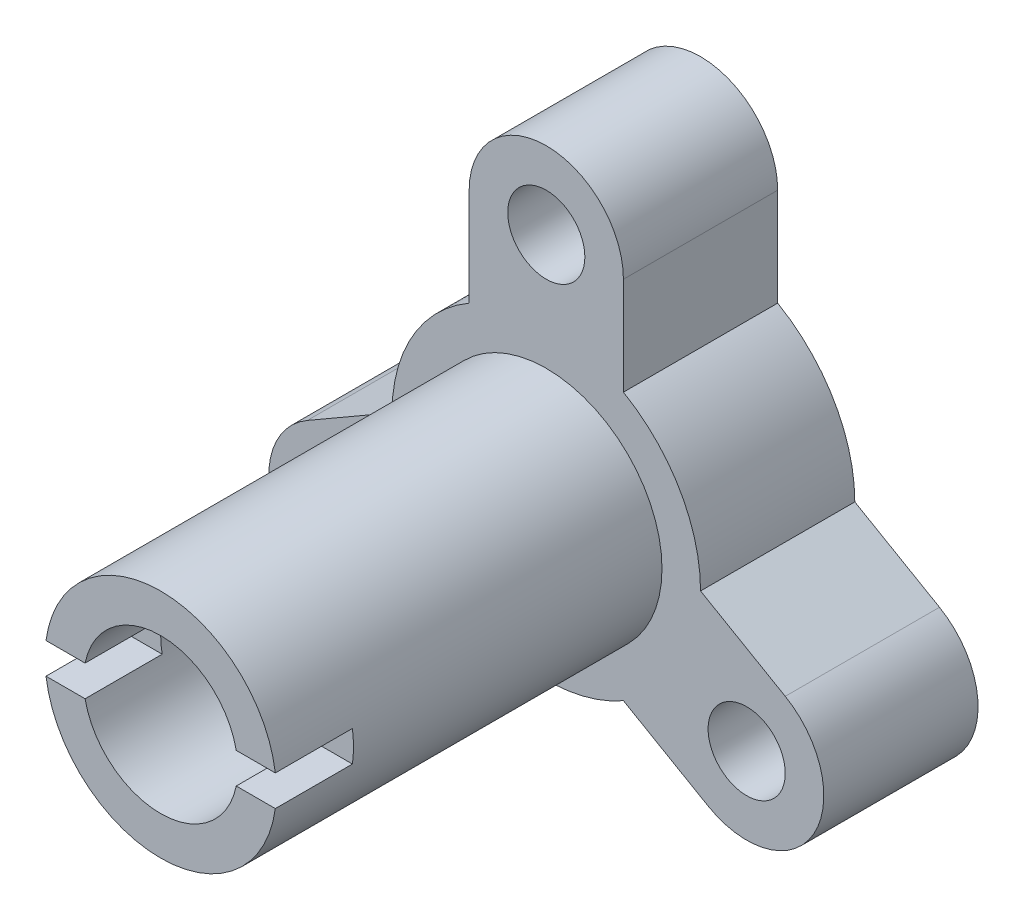
ISO-10303-21;
HEADER;
FILE_DESCRIPTION(('STEP AP214'),'2;1');
FILE_NAME('part.step','',(''),(''),'','','');
FILE_SCHEMA(('AUTOMOTIVE_DESIGN { 1 0 10303 214 1 1 1 1 }'));
ENDSEC;
DATA;
#1=APPLICATION_CONTEXT('core data for automotive mechanical design processes');
#2=APPLICATION_PROTOCOL_DEFINITION('international standard','automotive_design',2000,#1);
#3=PRODUCT_CONTEXT('',#1,'mechanical');
#4=PRODUCT('Part','Part','',(#3));
#5=PRODUCT_RELATED_PRODUCT_CATEGORY('part','',(#4));
#6=PRODUCT_DEFINITION_FORMATION('','',#4);
#7=PRODUCT_DEFINITION_CONTEXT('part definition',#1,'design');
#8=PRODUCT_DEFINITION('design','',#6,#7);
#9=PRODUCT_DEFINITION_SHAPE('','',#8);
#10=(LENGTH_UNIT() NAMED_UNIT(*) SI_UNIT(.MILLI.,.METRE.));
#11=(NAMED_UNIT(*) PLANE_ANGLE_UNIT() SI_UNIT($,.RADIAN.));
#12=(NAMED_UNIT(*) SI_UNIT($,.STERADIAN.) SOLID_ANGLE_UNIT());
#13=UNCERTAINTY_MEASURE_WITH_UNIT(LENGTH_MEASURE(1.E-05),#10,'distance_accuracy_value','');
#14=(GEOMETRIC_REPRESENTATION_CONTEXT(3) GLOBAL_UNCERTAINTY_ASSIGNED_CONTEXT((#13)) GLOBAL_UNIT_ASSIGNED_CONTEXT((#10,
#11,#12)) REPRESENTATION_CONTEXT('',''));
#15=CARTESIAN_POINT('',(0.,0.,0.));
#16=DIRECTION('',(0.,0.,1.));
#17=DIRECTION('',(1.,0.,0.));
#18=AXIS2_PLACEMENT_3D('',#15,#16,#17);
#19=CARTESIAN_POINT('',(0.,0.,70.));
#20=DIRECTION('',(0.,0.,1.));
#21=DIRECTION('',(1.,0.,0.));
#22=AXIS2_PLACEMENT_3D('',#19,#20,#21);
#23=PLANE('',#22);
#24=DIRECTION('',(1.,0.,0.));
#25=VECTOR('',#24,1.);
#26=CARTESIAN_POINT('',(-26.7915531805762,-2.,70.));
#27=LINE('',#26,#25);
#28=CARTESIAN_POINT('',(-14.8660687473185,-2.,70.));
#29=VERTEX_POINT('',#28);
#30=CARTESIAN_POINT('',(-9.79795897113271,-2.,70.));
#31=VERTEX_POINT('',#30);
#32=EDGE_CURVE('E339',#29,#31,#27,.T.);
#33=ORIENTED_EDGE('',*,*,#32,.F.);
#34=CARTESIAN_POINT('',(0.,0.,70.));
#35=DIRECTION('',(0.,0.,1.));
#36=DIRECTION('',(1.,0.,0.));
#37=AXIS2_PLACEMENT_3D('',#34,#35,#36);
#38=CIRCLE('',#37,15.);
#39=CARTESIAN_POINT('',(14.8660687473185,-2.,70.));
#40=VERTEX_POINT('',#39);
#41=EDGE_CURVE('E196',#29,#40,#38,.T.);
#42=ORIENTED_EDGE('',*,*,#41,.T.);
#43=CARTESIAN_POINT('',(9.79795897113271,-2.,70.));
#44=VERTEX_POINT('',#43);
#45=EDGE_CURVE('E187',#44,#40,#27,.T.);
#46=ORIENTED_EDGE('',*,*,#45,.F.);
#47=CARTESIAN_POINT('',(0.,0.,70.));
#48=DIRECTION('',(0.,0.,1.));
#49=DIRECTION('',(1.,0.,0.));
#50=AXIS2_PLACEMENT_3D('',#47,#48,#49);
#51=CIRCLE('',#50,10.);
#52=EDGE_CURVE('E353',#31,#44,#51,.T.);
#53=ORIENTED_EDGE('',*,*,#52,.F.);
#54=EDGE_LOOP('',(#33,#42,#46,#53));
#55=FACE_BOUND('',#54,.T.);
#56=ADVANCED_FACE('F33',(#55),#23,.T.);
#57=CARTESIAN_POINT('',(10.,0.,20.));
#58=DIRECTION('',(1.,0.,0.));
#59=DIRECTION('',(0.,1.,0.));
#60=AXIS2_PLACEMENT_3D('',#57,#58,#59);
#61=PLANE('',#60);
#62=DIRECTION('',(0.,-1.,0.));
#63=VECTOR('',#62,1.);
#64=CARTESIAN_POINT('',(10.,0.,0.));
#65=LINE('',#64,#63);
#66=CARTESIAN_POINT('',(10.,30.,0.));
#67=VERTEX_POINT('',#66);
#68=CARTESIAN_POINT('',(10.,17.3205080756888,0.));
#69=VERTEX_POINT('',#68);
#70=EDGE_CURVE('E199',#67,#69,#65,.T.);
#71=ORIENTED_EDGE('',*,*,#70,.F.);
#72=DIRECTION('',(0.,0.,-1.));
#73=VECTOR('',#72,1.);
#74=CARTESIAN_POINT('',(10.,30.,20.));
#75=LINE('',#74,#73);
#76=CARTESIAN_POINT('',(10.,30.,20.));
#77=VERTEX_POINT('',#76);
#78=EDGE_CURVE('E313',#77,#67,#75,.T.);
#79=ORIENTED_EDGE('',*,*,#78,.F.);
#80=DIRECTION('',(0.,-1.,0.));
#81=VECTOR('',#80,1.);
#82=CARTESIAN_POINT('',(10.,0.,20.));
#83=LINE('',#82,#81);
#84=CARTESIAN_POINT('',(10.,17.3205080756888,20.));
#85=VERTEX_POINT('',#84);
#86=EDGE_CURVE('E211',#77,#85,#83,.T.);
#87=ORIENTED_EDGE('',*,*,#86,.T.);
#88=DIRECTION('',(0.,0.,-1.));
#89=VECTOR('',#88,1.);
#90=CARTESIAN_POINT('',(10.,17.3205080756888,20.));
#91=LINE('',#90,#89);
#92=EDGE_CURVE('E248',#85,#69,#91,.T.);
#93=ORIENTED_EDGE('',*,*,#92,.T.);
#94=EDGE_LOOP('',(#71,#79,#87,#93));
#95=FACE_BOUND('',#94,.T.);
#96=ADVANCED_FACE('F373',(#95),#61,.T.);
#97=CARTESIAN_POINT('',(0.,30.,20.));
#98=DIRECTION('',(0.,0.,-1.));
#99=DIRECTION('',(-1.,0.,0.));
#100=AXIS2_PLACEMENT_3D('',#97,#98,#99);
#101=CYLINDRICAL_SURFACE('',#100,10.);
#102=CARTESIAN_POINT('',(0.,30.,0.));
#103=DIRECTION('',(0.,0.,1.));
#104=DIRECTION('',(1.,0.,0.));
#105=AXIS2_PLACEMENT_3D('',#102,#103,#104);
#106=CIRCLE('',#105,10.);
#107=CARTESIAN_POINT('',(-10.,30.,0.));
#108=VERTEX_POINT('',#107);
#109=EDGE_CURVE('E252',#67,#108,#106,.T.);
#110=ORIENTED_EDGE('',*,*,#109,.T.);
#111=DIRECTION('',(0.,0.,-1.));
#112=VECTOR('',#111,1.);
#113=CARTESIAN_POINT('',(-10.,30.,20.));
#114=LINE('',#113,#112);
#115=CARTESIAN_POINT('',(-10.,30.,20.));
#116=VERTEX_POINT('',#115);
#117=EDGE_CURVE('E310',#116,#108,#114,.T.);
#118=ORIENTED_EDGE('',*,*,#117,.F.);
#119=CARTESIAN_POINT('',(0.,30.,20.));
#120=DIRECTION('',(0.,0.,1.));
#121=DIRECTION('',(1.,0.,0.));
#122=AXIS2_PLACEMENT_3D('',#119,#120,#121);
#123=CIRCLE('',#122,10.);
#124=EDGE_CURVE('E215',#77,#116,#123,.T.);
#125=ORIENTED_EDGE('',*,*,#124,.F.);
#126=ORIENTED_EDGE('',*,*,#78,.T.);
#127=EDGE_LOOP('',(#110,#118,#125,#126));
#128=FACE_BOUND('',#127,.T.);
#129=ADVANCED_FACE('F378',(#128),#101,.T.);
#130=CARTESIAN_POINT('',(-9.99999999999999,0.,20.));
#131=DIRECTION('',(1.,0.,0.));
#132=DIRECTION('',(0.,1.,0.));
#133=AXIS2_PLACEMENT_3D('',#130,#131,#132);
#134=PLANE('',#133);
#135=DIRECTION('',(0.,-1.,0.));
#136=VECTOR('',#135,1.);
#137=CARTESIAN_POINT('',(-9.99999999999999,0.,0.));
#138=LINE('',#137,#136);
#139=CARTESIAN_POINT('',(-10.,17.3205080756888,0.));
#140=VERTEX_POINT('',#139);
#141=EDGE_CURVE('E255',#108,#140,#138,.T.);
#142=ORIENTED_EDGE('',*,*,#141,.T.);
#143=DIRECTION('',(0.,0.,-1.));
#144=VECTOR('',#143,1.);
#145=CARTESIAN_POINT('',(-10.,17.3205080756888,20.));
#146=LINE('',#145,#144);
#147=CARTESIAN_POINT('',(-10.,17.3205080756888,20.));
#148=VERTEX_POINT('',#147);
#149=EDGE_CURVE('E307',#148,#140,#146,.T.);
#150=ORIENTED_EDGE('',*,*,#149,.F.);
#151=DIRECTION('',(0.,-1.,0.));
#152=VECTOR('',#151,1.);
#153=CARTESIAN_POINT('',(-9.99999999999999,0.,20.));
#154=LINE('',#153,#152);
#155=EDGE_CURVE('E218',#116,#148,#154,.T.);
#156=ORIENTED_EDGE('',*,*,#155,.F.);
#157=ORIENTED_EDGE('',*,*,#117,.T.);
#158=EDGE_LOOP('',(#142,#150,#156,#157));
#159=FACE_BOUND('',#158,.T.);
#160=ADVANCED_FACE('F437',(#159),#134,.F.);
#161=CARTESIAN_POINT('',(0.,0.,20.));
#162=DIRECTION('',(0.,0.,-1.));
#163=DIRECTION('',(-1.,0.,0.));
#164=AXIS2_PLACEMENT_3D('',#161,#162,#163);
#165=CYLINDRICAL_SURFACE('',#164,20.);
#166=CARTESIAN_POINT('',(0.,0.,0.));
#167=DIRECTION('',(0.,0.,1.));
#168=DIRECTION('',(1.,0.,0.));
#169=AXIS2_PLACEMENT_3D('',#166,#167,#168);
#170=CIRCLE('',#169,20.);
#171=CARTESIAN_POINT('',(-19.9999999999975,-1.46931078415254E-12,0.));
#172=VERTEX_POINT('',#171);
#173=EDGE_CURVE('E258',#140,#172,#170,.T.);
#174=ORIENTED_EDGE('',*,*,#173,.T.);
#175=DIRECTION('',(0.,0.,-1.));
#176=VECTOR('',#175,1.);
#177=CARTESIAN_POINT('',(-19.9999999999975,-1.46931078415254E-12,20.));
#178=LINE('',#177,#176);
#179=CARTESIAN_POINT('',(-19.9999999999975,-1.46931078415254E-12,20.));
#180=VERTEX_POINT('',#179);
#181=EDGE_CURVE('E305',#180,#172,#178,.T.);
#182=ORIENTED_EDGE('',*,*,#181,.F.);
#183=CARTESIAN_POINT('',(0.,0.,20.));
#184=DIRECTION('',(0.,0.,1.));
#185=DIRECTION('',(1.,0.,0.));
#186=AXIS2_PLACEMENT_3D('',#183,#184,#185);
#187=CIRCLE('',#186,20.);
#188=EDGE_CURVE('E221',#148,#180,#187,.T.);
#189=ORIENTED_EDGE('',*,*,#188,.F.);
#190=ORIENTED_EDGE('',*,*,#149,.T.);
#191=EDGE_LOOP('',(#174,#182,#189,#190));
#192=FACE_BOUND('',#191,.T.);
#193=ADVANCED_FACE('F412',(#192),#165,.T.);
#194=CARTESIAN_POINT('',(-4.99999999999812,8.66025403784113,20.));
#195=DIRECTION('',(-0.5,0.866025403784439,0.));
#196=DIRECTION('',(-0.866025403784439,-0.5,0.));
#197=AXIS2_PLACEMENT_3D('',#194,#195,#196);
#198=PLANE('',#197);
#199=DIRECTION('',(0.866025403784439,0.5,0.));
#200=VECTOR('',#199,1.);
#201=CARTESIAN_POINT('',(-4.99999999999812,8.66025403784113,0.));
#202=LINE('',#201,#200);
#203=CARTESIAN_POINT('',(-30.9807621135282,-6.33974596215708,0.));
#204=VERTEX_POINT('',#203);
#205=EDGE_CURVE('E261',#204,#172,#202,.T.);
#206=ORIENTED_EDGE('',*,*,#205,.F.);
#207=DIRECTION('',(0.,0.,-1.));
#208=VECTOR('',#207,1.);
#209=CARTESIAN_POINT('',(-30.9807621135282,-6.33974596215708,20.));
#210=LINE('',#209,#208);
#211=CARTESIAN_POINT('',(-30.9807621135282,-6.33974596215708,20.));
#212=VERTEX_POINT('',#211);
#213=EDGE_CURVE('E303',#212,#204,#210,.T.);
#214=ORIENTED_EDGE('',*,*,#213,.F.);
#215=DIRECTION('',(0.866025403784439,0.5,0.));
#216=VECTOR('',#215,1.);
#217=CARTESIAN_POINT('',(-4.99999999999812,8.66025403784113,20.));
#218=LINE('',#217,#216);
#219=EDGE_CURVE('E223',#212,#180,#218,.T.);
#220=ORIENTED_EDGE('',*,*,#219,.T.);
#221=ORIENTED_EDGE('',*,*,#181,.T.);
#222=EDGE_LOOP('',(#206,#214,#220,#221));
#223=FACE_BOUND('',#222,.T.);
#224=ADVANCED_FACE('F432',(#223),#198,.T.);
#225=CARTESIAN_POINT('',(-25.9807621135282,-15.0000000000015,20.));
#226=DIRECTION('',(0.,0.,-1.));
#227=DIRECTION('',(-1.,0.,0.));
#228=AXIS2_PLACEMENT_3D('',#225,#226,#227);
#229=CYLINDRICAL_SURFACE('',#228,10.);
#230=CARTESIAN_POINT('',(-25.9807621135282,-15.0000000000015,0.));
#231=DIRECTION('',(0.,0.,1.));
#232=DIRECTION('',(1.,0.,0.));
#233=AXIS2_PLACEMENT_3D('',#230,#231,#232);
#234=CIRCLE('',#233,10.);
#235=CARTESIAN_POINT('',(-20.9807621135282,-23.6602540378459,0.));
#236=VERTEX_POINT('',#235);
#237=EDGE_CURVE('E266',#204,#236,#234,.T.);
#238=ORIENTED_EDGE('',*,*,#237,.T.);
#239=DIRECTION('',(0.,0.,-1.));
#240=VECTOR('',#239,1.);
#241=CARTESIAN_POINT('',(-20.9807621135282,-23.6602540378459,20.));
#242=LINE('',#241,#240);
#243=CARTESIAN_POINT('',(-20.9807621135282,-23.6602540378459,20.));
#244=VERTEX_POINT('',#243);
#245=EDGE_CURVE('E300',#244,#236,#242,.T.);
#246=ORIENTED_EDGE('',*,*,#245,.F.);
#247=CARTESIAN_POINT('',(-25.9807621135282,-15.0000000000015,20.));
#248=DIRECTION('',(0.,0.,1.));
#249=DIRECTION('',(1.,0.,0.));
#250=AXIS2_PLACEMENT_3D('',#247,#248,#249);
#251=CIRCLE('',#250,10.);
#252=EDGE_CURVE('E228',#212,#244,#251,.T.);
#253=ORIENTED_EDGE('',*,*,#252,.F.);
#254=ORIENTED_EDGE('',*,*,#213,.T.);
#255=EDGE_LOOP('',(#238,#246,#253,#254));
#256=FACE_BOUND('',#255,.T.);
#257=ADVANCED_FACE('F428',(#256),#229,.T.);
#258=CARTESIAN_POINT('',(5.00000000000189,-8.66025403784766,20.));
#259=DIRECTION('',(-0.5,0.866025403784439,0.));
#260=DIRECTION('',(-0.866025403784439,-0.5,0.));
#261=AXIS2_PLACEMENT_3D('',#258,#259,#260);
#262=PLANE('',#261);
#263=DIRECTION('',(0.866025403784439,0.5,0.));
#264=VECTOR('',#263,1.);
#265=CARTESIAN_POINT('',(5.00000000000189,-8.66025403784766,0.));
#266=LINE('',#265,#264);
#267=CARTESIAN_POINT('',(-9.99999999999532,-17.3205080756908,0.));
#268=VERTEX_POINT('',#267);
#269=EDGE_CURVE('E269',#236,#268,#266,.T.);
#270=ORIENTED_EDGE('',*,*,#269,.T.);
#271=DIRECTION('',(0.,0.,-1.));
#272=VECTOR('',#271,1.);
#273=CARTESIAN_POINT('',(-9.99999999999532,-17.3205080756908,20.));
#274=LINE('',#273,#272);
#275=CARTESIAN_POINT('',(-9.99999999999532,-17.3205080756908,20.));
#276=VERTEX_POINT('',#275);
#277=EDGE_CURVE('E297',#276,#268,#274,.T.);
#278=ORIENTED_EDGE('',*,*,#277,.F.);
#279=DIRECTION('',(0.866025403784439,0.5,0.));
#280=VECTOR('',#279,1.);
#281=CARTESIAN_POINT('',(5.00000000000189,-8.66025403784766,20.));
#282=LINE('',#281,#280);
#283=EDGE_CURVE('E231',#244,#276,#282,.T.);
#284=ORIENTED_EDGE('',*,*,#283,.F.);
#285=ORIENTED_EDGE('',*,*,#245,.T.);
#286=EDGE_LOOP('',(#270,#278,#284,#285));
#287=FACE_BOUND('',#286,.T.);
#288=ADVANCED_FACE('F425',(#287),#262,.F.);
#289=CARTESIAN_POINT('',(10.0000000000041,-17.3205080756857,0.));
#290=VERTEX_POINT('',#289);
#291=EDGE_CURVE('E263',#268,#290,#170,.T.);
#292=ORIENTED_EDGE('',*,*,#291,.T.);
#293=DIRECTION('',(0.,0.,-1.));
#294=VECTOR('',#293,1.);
#295=CARTESIAN_POINT('',(10.0000000000041,-17.3205080756857,20.));
#296=LINE('',#295,#294);
#297=CARTESIAN_POINT('',(10.0000000000041,-17.3205080756857,20.));
#298=VERTEX_POINT('',#297);
#299=EDGE_CURVE('E295',#298,#290,#296,.T.);
#300=ORIENTED_EDGE('',*,*,#299,.F.);
#301=EDGE_CURVE('E225',#276,#298,#187,.T.);
#302=ORIENTED_EDGE('',*,*,#301,.F.);
#303=ORIENTED_EDGE('',*,*,#277,.T.);
#304=EDGE_LOOP('',(#292,#300,#302,#303));
#305=FACE_BOUND('',#304,.T.);
#306=ADVANCED_FACE('F413',(#305),#165,.T.);
#307=CARTESIAN_POINT('',(-4.99999999999751,-8.66025403784006,20.));
#308=DIRECTION('',(-0.5,-0.866025403784438,0.));
#309=DIRECTION('',(0.866025403784438,-0.5,0.));
#310=AXIS2_PLACEMENT_3D('',#307,#308,#309);
#311=PLANE('',#310);
#312=DIRECTION('',(-0.866025403784438,0.5,0.));
#313=VECTOR('',#312,1.);
#314=CARTESIAN_POINT('',(-4.99999999999751,-8.66025403784006,0.));
#315=LINE('',#314,#313);
#316=CARTESIAN_POINT('',(20.9807621135369,-23.6602540378408,0.));
#317=VERTEX_POINT('',#316);
#318=EDGE_CURVE('E272',#317,#290,#315,.T.);
#319=ORIENTED_EDGE('',*,*,#318,.F.);
#320=DIRECTION('',(0.,0.,-1.));
#321=VECTOR('',#320,1.);
#322=CARTESIAN_POINT('',(20.9807621135369,-23.6602540378408,20.));
#323=LINE('',#322,#321);
#324=CARTESIAN_POINT('',(20.9807621135369,-23.6602540378408,20.));
#325=VERTEX_POINT('',#324);
#326=EDGE_CURVE('E293',#325,#317,#323,.T.);
#327=ORIENTED_EDGE('',*,*,#326,.F.);
#328=DIRECTION('',(-0.866025403784438,0.5,0.));
#329=VECTOR('',#328,1.);
#330=CARTESIAN_POINT('',(-4.99999999999751,-8.66025403784006,20.));
#331=LINE('',#330,#329);
#332=EDGE_CURVE('E234',#325,#298,#331,.T.);
#333=ORIENTED_EDGE('',*,*,#332,.T.);
#334=ORIENTED_EDGE('',*,*,#299,.T.);
#335=EDGE_LOOP('',(#319,#327,#333,#334));
#336=FACE_BOUND('',#335,.T.);
#337=ADVANCED_FACE('F420',(#336),#311,.T.);
#338=CARTESIAN_POINT('',(25.9807621135369,-14.9999999999964,20.));
#339=DIRECTION('',(0.,0.,-1.));
#340=DIRECTION('',(-1.,0.,0.));
#341=AXIS2_PLACEMENT_3D('',#338,#339,#340);
#342=CYLINDRICAL_SURFACE('',#341,10.);
#343=CARTESIAN_POINT('',(25.9807621135369,-14.9999999999964,0.));
#344=DIRECTION('',(0.,0.,1.));
#345=DIRECTION('',(1.,0.,0.));
#346=AXIS2_PLACEMENT_3D('',#343,#344,#345);
#347=CIRCLE('',#346,10.);
#348=CARTESIAN_POINT('',(30.9807621135369,-6.33974596215204,0.));
#349=VERTEX_POINT('',#348);
#350=EDGE_CURVE('E275',#317,#349,#347,.T.);
#351=ORIENTED_EDGE('',*,*,#350,.T.);
#352=DIRECTION('',(0.,0.,-1.));
#353=VECTOR('',#352,1.);
#354=CARTESIAN_POINT('',(30.9807621135369,-6.33974596215204,20.));
#355=LINE('',#354,#353);
#356=CARTESIAN_POINT('',(30.9807621135369,-6.33974596215204,20.));
#357=VERTEX_POINT('',#356);
#358=EDGE_CURVE('E290',#357,#349,#355,.T.);
#359=ORIENTED_EDGE('',*,*,#358,.F.);
#360=CARTESIAN_POINT('',(25.9807621135369,-14.9999999999964,20.));
#361=DIRECTION('',(0.,0.,1.));
#362=DIRECTION('',(1.,0.,0.));
#363=AXIS2_PLACEMENT_3D('',#360,#361,#362);
#364=CIRCLE('',#363,10.);
#365=EDGE_CURVE('E237',#325,#357,#364,.T.);
#366=ORIENTED_EDGE('',*,*,#365,.F.);
#367=ORIENTED_EDGE('',*,*,#326,.T.);
#368=EDGE_LOOP('',(#351,#359,#366,#367));
#369=FACE_BOUND('',#368,.T.);
#370=ADVANCED_FACE('F416',(#369),#342,.T.);
#371=CARTESIAN_POINT('',(5.0000000000025,8.66025403784871,20.));
#372=DIRECTION('',(-0.5,-0.866025403784438,0.));
#373=DIRECTION('',(0.866025403784438,-0.5,0.));
#374=AXIS2_PLACEMENT_3D('',#371,#372,#373);
#375=PLANE('',#374);
#376=DIRECTION('',(-0.866025403784438,0.5,0.));
#377=VECTOR('',#376,1.);
#378=CARTESIAN_POINT('',(5.0000000000025,8.66025403784871,0.));
#379=LINE('',#378,#377);
#380=CARTESIAN_POINT('',(20.0000000000019,3.57873453093982E-12,0.));
#381=VERTEX_POINT('',#380);
#382=EDGE_CURVE('E278',#349,#381,#379,.T.);
#383=ORIENTED_EDGE('',*,*,#382,.T.);
#384=DIRECTION('',(0.,0.,-1.));
#385=VECTOR('',#384,1.);
#386=CARTESIAN_POINT('',(20.0000000000019,3.57873453093982E-12,20.));
#387=LINE('',#386,#385);
#388=CARTESIAN_POINT('',(20.0000000000019,3.57873453093982E-12,20.));
#389=VERTEX_POINT('',#388);
#390=EDGE_CURVE('E287',#389,#381,#387,.T.);
#391=ORIENTED_EDGE('',*,*,#390,.F.);
#392=DIRECTION('',(-0.866025403784438,0.5,0.));
#393=VECTOR('',#392,1.);
#394=CARTESIAN_POINT('',(5.0000000000025,8.66025403784871,20.));
#395=LINE('',#394,#393);
#396=EDGE_CURVE('E240',#357,#389,#395,.T.);
#397=ORIENTED_EDGE('',*,*,#396,.F.);
#398=ORIENTED_EDGE('',*,*,#358,.T.);
#399=EDGE_LOOP('',(#383,#391,#397,#398));
#400=FACE_BOUND('',#399,.T.);
#401=ADVANCED_FACE('F407',(#400),#375,.F.);
#402=CARTESIAN_POINT('',(25.9807621135369,-14.9999999999964,20.));
#403=DIRECTION('',(0.,0.,-1.));
#404=DIRECTION('',(-1.,0.,0.));
#405=AXIS2_PLACEMENT_3D('',#402,#403,#404);
#406=CYLINDRICAL_SURFACE('',#405,5.00000000000407);
#407=CARTESIAN_POINT('',(25.9807621135369,-14.9999999999964,20.));
#408=DIRECTION('',(0.,0.,1.));
#409=DIRECTION('',(1.,0.,0.));
#410=AXIS2_PLACEMENT_3D('',#407,#408,#409);
#411=CIRCLE('',#410,5.00000000000407);
#412=CARTESIAN_POINT('',(30.980762113541,-14.9999999999964,20.));
#413=VERTEX_POINT('',#412);
#414=EDGE_CURVE('E243',#413,#413,#411,.T.);
#415=ORIENTED_EDGE('',*,*,#414,.T.);
#416=EDGE_LOOP('',(#415));
#417=FACE_BOUND('',#416,.T.);
#418=CARTESIAN_POINT('',(25.9807621135369,-14.9999999999964,0.));
#419=DIRECTION('',(0.,0.,1.));
#420=DIRECTION('',(1.,0.,0.));
#421=AXIS2_PLACEMENT_3D('',#418,#419,#420);
#422=CIRCLE('',#421,5.00000000000407);
#423=CARTESIAN_POINT('',(30.980762113541,-14.9999999999964,0.));
#424=VERTEX_POINT('',#423);
#425=EDGE_CURVE('E281',#424,#424,#422,.T.);
#426=ORIENTED_EDGE('',*,*,#425,.F.);
#427=EDGE_LOOP('',(#426));
#428=FACE_BOUND('',#427,.T.);
#429=ADVANCED_FACE('F403',(#417,#428),#406,.F.);
#430=EDGE_CURVE('E262',#381,#69,#170,.T.);
#431=ORIENTED_EDGE('',*,*,#430,.T.);
#432=ORIENTED_EDGE('',*,*,#92,.F.);
#433=EDGE_CURVE('E224',#389,#85,#187,.T.);
#434=ORIENTED_EDGE('',*,*,#433,.F.);
#435=ORIENTED_EDGE('',*,*,#390,.T.);
#436=EDGE_LOOP('',(#431,#432,#434,#435));
#437=FACE_BOUND('',#436,.T.);
#438=ADVANCED_FACE('F406',(#437),#165,.T.);
#439=CARTESIAN_POINT('',(0.,30.,20.));
#440=DIRECTION('',(0.,0.,-1.));
#441=DIRECTION('',(-1.,0.,0.));
#442=AXIS2_PLACEMENT_3D('',#439,#440,#441);
#443=CYLINDRICAL_SURFACE('',#442,5.);
#444=CARTESIAN_POINT('',(0.,30.,20.));
#445=DIRECTION('',(0.,0.,1.));
#446=DIRECTION('',(1.,0.,0.));
#447=AXIS2_PLACEMENT_3D('',#444,#445,#446);
#448=CIRCLE('',#447,5.);
#449=CARTESIAN_POINT('',(5.,30.,20.));
#450=VERTEX_POINT('',#449);
#451=EDGE_CURVE('E208',#450,#450,#448,.T.);
#452=ORIENTED_EDGE('',*,*,#451,.T.);
#453=EDGE_LOOP('',(#452));
#454=FACE_BOUND('',#453,.T.);
#455=CARTESIAN_POINT('',(0.,30.,0.));
#456=DIRECTION('',(0.,0.,1.));
#457=DIRECTION('',(1.,0.,0.));
#458=AXIS2_PLACEMENT_3D('',#455,#456,#457);
#459=CIRCLE('',#458,5.);
#460=CARTESIAN_POINT('',(5.,30.,0.));
#461=VERTEX_POINT('',#460);
#462=EDGE_CURVE('E195',#461,#461,#459,.T.);
#463=ORIENTED_EDGE('',*,*,#462,.F.);
#464=EDGE_LOOP('',(#463));
#465=FACE_BOUND('',#464,.T.);
#466=ADVANCED_FACE('F35',(#454,#465),#443,.F.);
#467=CARTESIAN_POINT('',(-25.9807621135282,-15.0000000000015,20.));
#468=DIRECTION('',(0.,0.,-1.));
#469=DIRECTION('',(-1.,0.,0.));
#470=AXIS2_PLACEMENT_3D('',#467,#468,#469);
#471=CYLINDRICAL_SURFACE('',#470,5.00000000000452);
#472=CARTESIAN_POINT('',(-25.9807621135282,-15.0000000000015,20.));
#473=DIRECTION('',(0.,0.,1.));
#474=DIRECTION('',(1.,0.,0.));
#475=AXIS2_PLACEMENT_3D('',#472,#473,#474);
#476=CIRCLE('',#475,5.00000000000452);
#477=CARTESIAN_POINT('',(-20.9807621135237,-15.0000000000015,20.));
#478=VERTEX_POINT('',#477);
#479=EDGE_CURVE('E246',#478,#478,#476,.T.);
#480=ORIENTED_EDGE('',*,*,#479,.T.);
#481=EDGE_LOOP('',(#480));
#482=FACE_BOUND('',#481,.T.);
#483=CARTESIAN_POINT('',(-25.9807621135282,-15.0000000000015,0.));
#484=DIRECTION('',(0.,0.,1.));
#485=DIRECTION('',(1.,0.,0.));
#486=AXIS2_PLACEMENT_3D('',#483,#484,#485);
#487=CIRCLE('',#486,5.00000000000452);
#488=CARTESIAN_POINT('',(-20.9807621135237,-15.0000000000015,0.));
#489=VERTEX_POINT('',#488);
#490=EDGE_CURVE('E212',#489,#489,#487,.T.);
#491=ORIENTED_EDGE('',*,*,#490,.F.);
#492=EDGE_LOOP('',(#491));
#493=FACE_BOUND('',#492,.T.);
#494=ADVANCED_FACE('F394',(#482,#493),#471,.F.);
#495=CARTESIAN_POINT('',(0.,0.,20.));
#496=DIRECTION('',(0.,0.,1.));
#497=DIRECTION('',(1.,0.,0.));
#498=AXIS2_PLACEMENT_3D('',#495,#496,#497);
#499=PLANE('',#498);
#500=CARTESIAN_POINT('',(0.,0.,20.));
#501=DIRECTION('',(0.,0.,1.));
#502=DIRECTION('',(1.,0.,0.));
#503=AXIS2_PLACEMENT_3D('',#500,#501,#502);
#504=CIRCLE('',#503,15.);
#505=CARTESIAN_POINT('',(15.,0.,20.));
#506=VERTEX_POINT('',#505);
#507=EDGE_CURVE('E202',#506,#506,#504,.T.);
#508=ORIENTED_EDGE('',*,*,#507,.F.);
#509=EDGE_LOOP('',(#508));
#510=FACE_BOUND('',#509,.T.);
#511=ORIENTED_EDGE('',*,*,#451,.F.);
#512=EDGE_LOOP('',(#511));
#513=FACE_BOUND('',#512,.T.);
#514=ORIENTED_EDGE('',*,*,#86,.F.);
#515=ORIENTED_EDGE('',*,*,#124,.T.);
#516=ORIENTED_EDGE('',*,*,#155,.T.);
#517=ORIENTED_EDGE('',*,*,#188,.T.);
#518=ORIENTED_EDGE('',*,*,#219,.F.);
#519=ORIENTED_EDGE('',*,*,#252,.T.);
#520=ORIENTED_EDGE('',*,*,#283,.T.);
#521=ORIENTED_EDGE('',*,*,#301,.T.);
#522=ORIENTED_EDGE('',*,*,#332,.F.);
#523=ORIENTED_EDGE('',*,*,#365,.T.);
#524=ORIENTED_EDGE('',*,*,#396,.T.);
#525=ORIENTED_EDGE('',*,*,#433,.T.);
#526=EDGE_LOOP('',(#514,#515,#516,#517,#518,#519,#520,#521,#522,#523,#524,#525));
#527=FACE_BOUND('',#526,.T.);
#528=ORIENTED_EDGE('',*,*,#414,.F.);
#529=EDGE_LOOP('',(#528));
#530=FACE_BOUND('',#529,.T.);
#531=ORIENTED_EDGE('',*,*,#479,.F.);
#532=EDGE_LOOP('',(#531));
#533=FACE_BOUND('',#532,.T.);
#534=ADVANCED_FACE('F388',(#510,#513,#527,#530,#533),#499,.T.);
#535=CARTESIAN_POINT('',(0.,0.,0.));
#536=DIRECTION('',(0.,0.,1.));
#537=DIRECTION('',(1.,0.,0.));
#538=AXIS2_PLACEMENT_3D('',#535,#536,#537);
#539=PLANE('',#538);
#540=ORIENTED_EDGE('',*,*,#462,.T.);
#541=EDGE_LOOP('',(#540));
#542=FACE_BOUND('',#541,.T.);
#543=ORIENTED_EDGE('',*,*,#70,.T.);
#544=ORIENTED_EDGE('',*,*,#430,.F.);
#545=ORIENTED_EDGE('',*,*,#382,.F.);
#546=ORIENTED_EDGE('',*,*,#350,.F.);
#547=ORIENTED_EDGE('',*,*,#318,.T.);
#548=ORIENTED_EDGE('',*,*,#291,.F.);
#549=ORIENTED_EDGE('',*,*,#269,.F.);
#550=ORIENTED_EDGE('',*,*,#237,.F.);
#551=ORIENTED_EDGE('',*,*,#205,.T.);
#552=ORIENTED_EDGE('',*,*,#173,.F.);
#553=ORIENTED_EDGE('',*,*,#141,.F.);
#554=ORIENTED_EDGE('',*,*,#109,.F.);
#555=EDGE_LOOP('',(#543,#544,#545,#546,#547,#548,#549,#550,#551,#552,#553,#554));
#556=FACE_BOUND('',#555,.T.);
#557=ORIENTED_EDGE('',*,*,#425,.T.);
#558=EDGE_LOOP('',(#557));
#559=FACE_BOUND('',#558,.T.);
#560=ORIENTED_EDGE('',*,*,#490,.T.);
#561=EDGE_LOOP('',(#560));
#562=FACE_BOUND('',#561,.T.);
#563=ADVANCED_FACE('F383',(#542,#556,#559,#562),#539,.F.);
#564=DIRECTION('',(-1.,0.,0.));
#565=VECTOR('',#564,1.);
#566=CARTESIAN_POINT('',(-26.7915531805762,2.,70.));
#567=LINE('',#566,#565);
#568=CARTESIAN_POINT('',(14.8660687473185,2.,70.));
#569=VERTEX_POINT('',#568);
#570=CARTESIAN_POINT('',(9.79795897113271,2.,70.));
#571=VERTEX_POINT('',#570);
#572=EDGE_CURVE('E171',#569,#571,#567,.T.);
#573=ORIENTED_EDGE('',*,*,#572,.F.);
#574=CARTESIAN_POINT('',(-14.8660687473185,2.,70.));
#575=VERTEX_POINT('',#574);
#576=EDGE_CURVE('E184',#569,#575,#38,.T.);
#577=ORIENTED_EDGE('',*,*,#576,.T.);
#578=CARTESIAN_POINT('',(-9.79795897113271,2.,70.));
#579=VERTEX_POINT('',#578);
#580=EDGE_CURVE('E188',#579,#575,#567,.T.);
#581=ORIENTED_EDGE('',*,*,#580,.F.);
#582=EDGE_CURVE('E186',#571,#579,#51,.T.);
#583=ORIENTED_EDGE('',*,*,#582,.F.);
#584=EDGE_LOOP('',(#573,#577,#581,#583));
#585=FACE_BOUND('',#584,.T.);
#586=ADVANCED_FACE('F182',(#585),#23,.T.);
#587=CARTESIAN_POINT('',(0.,0.,70.));
#588=DIRECTION('',(0.,0.,-1.));
#589=DIRECTION('',(-1.,0.,0.));
#590=AXIS2_PLACEMENT_3D('',#587,#588,#589);
#591=CYLINDRICAL_SURFACE('',#590,15.);
#592=ORIENTED_EDGE('',*,*,#41,.F.);
#593=DIRECTION('',(0.,0.,-1.));
#594=VECTOR('',#593,1.);
#595=CARTESIAN_POINT('',(-14.8660687473185,-2.,70.));
#596=LINE('',#595,#594);
#597=CARTESIAN_POINT('',(-14.8660687473185,-2.,60.));
#598=VERTEX_POINT('',#597);
#599=EDGE_CURVE('E351',#29,#598,#596,.T.);
#600=ORIENTED_EDGE('',*,*,#599,.T.);
#601=CARTESIAN_POINT('',(0.,0.,60.));
#602=DIRECTION('',(0.,0.,1.));
#603=DIRECTION('',(1.,0.,0.));
#604=AXIS2_PLACEMENT_3D('',#601,#602,#603);
#605=CIRCLE('',#604,15.);
#606=CARTESIAN_POINT('',(-14.8660687473185,2.,60.));
#607=VERTEX_POINT('',#606);
#608=EDGE_CURVE('E348',#607,#598,#605,.T.);
#609=ORIENTED_EDGE('',*,*,#608,.F.);
#610=DIRECTION('',(0.,0.,-1.));
#611=VECTOR('',#610,1.);
#612=CARTESIAN_POINT('',(-14.8660687473185,2.,70.));
#613=LINE('',#612,#611);
#614=EDGE_CURVE('E177',#607,#575,#613,.F.);
#615=ORIENTED_EDGE('',*,*,#614,.T.);
#616=ORIENTED_EDGE('',*,*,#576,.F.);
#617=DIRECTION('',(0.,0.,-1.));
#618=VECTOR('',#617,1.);
#619=CARTESIAN_POINT('',(14.8660687473185,2.,70.));
#620=LINE('',#619,#618);
#621=CARTESIAN_POINT('',(14.8660687473185,2.,60.));
#622=VERTEX_POINT('',#621);
#623=EDGE_CURVE('E168',#569,#622,#620,.T.);
#624=ORIENTED_EDGE('',*,*,#623,.T.);
#625=CARTESIAN_POINT('',(14.8660687473185,-2.,60.));
#626=VERTEX_POINT('',#625);
#627=EDGE_CURVE('E346',#626,#622,#605,.T.);
#628=ORIENTED_EDGE('',*,*,#627,.F.);
#629=DIRECTION('',(0.,0.,-1.));
#630=VECTOR('',#629,1.);
#631=CARTESIAN_POINT('',(14.8660687473185,-2.,70.));
#632=LINE('',#631,#630);
#633=EDGE_CURVE('E176',#626,#40,#632,.F.);
#634=ORIENTED_EDGE('',*,*,#633,.T.);
#635=EDGE_LOOP('',(#592,#600,#609,#615,#616,#624,#628,#634));
#636=FACE_BOUND('',#635,.T.);
#637=ORIENTED_EDGE('',*,*,#507,.T.);
#638=EDGE_LOOP('',(#637));
#639=FACE_BOUND('',#638,.T.);
#640=ADVANCED_FACE('F192',(#636,#639),#591,.T.);
#641=CARTESIAN_POINT('',(0.,0.,70.));
#642=DIRECTION('',(0.,0.,-1.));
#643=DIRECTION('',(-1.,0.,0.));
#644=AXIS2_PLACEMENT_3D('',#641,#642,#643);
#645=CYLINDRICAL_SURFACE('',#644,10.);
#646=DIRECTION('',(0.,0.,-1.));
#647=VECTOR('',#646,1.);
#648=CARTESIAN_POINT('',(-9.79795897113271,-2.,70.));
#649=LINE('',#648,#647);
#650=CARTESIAN_POINT('',(-9.79795897113271,-2.,60.));
#651=VERTEX_POINT('',#650);
#652=EDGE_CURVE('E11',#31,#651,#649,.T.);
#653=ORIENTED_EDGE('',*,*,#652,.F.);
#654=ORIENTED_EDGE('',*,*,#52,.T.);
#655=DIRECTION('',(0.,0.,-1.));
#656=VECTOR('',#655,1.);
#657=CARTESIAN_POINT('',(9.79795897113271,-2.,70.));
#658=LINE('',#657,#656);
#659=CARTESIAN_POINT('',(9.79795897113271,-2.,60.));
#660=VERTEX_POINT('',#659);
#661=EDGE_CURVE('E324',#660,#44,#658,.F.);
#662=ORIENTED_EDGE('',*,*,#661,.F.);
#663=CARTESIAN_POINT('',(0.,0.,60.));
#664=DIRECTION('',(0.,0.,1.));
#665=DIRECTION('',(1.,0.,0.));
#666=AXIS2_PLACEMENT_3D('',#663,#664,#665);
#667=CIRCLE('',#666,10.);
#668=CARTESIAN_POINT('',(9.79795897113271,2.,60.));
#669=VERTEX_POINT('',#668);
#670=EDGE_CURVE('E318',#660,#669,#667,.T.);
#671=ORIENTED_EDGE('',*,*,#670,.T.);
#672=DIRECTION('',(0.,0.,-1.));
#673=VECTOR('',#672,1.);
#674=CARTESIAN_POINT('',(9.79795897113271,2.,70.));
#675=LINE('',#674,#673);
#676=EDGE_CURVE('E321',#571,#669,#675,.T.);
#677=ORIENTED_EDGE('',*,*,#676,.F.);
#678=ORIENTED_EDGE('',*,*,#582,.T.);
#679=DIRECTION('',(0.,0.,-1.));
#680=VECTOR('',#679,1.);
#681=CARTESIAN_POINT('',(-9.79795897113271,2.,70.));
#682=LINE('',#681,#680);
#683=CARTESIAN_POINT('',(-9.79795897113271,2.,60.));
#684=VERTEX_POINT('',#683);
#685=EDGE_CURVE('E41',#684,#579,#682,.F.);
#686=ORIENTED_EDGE('',*,*,#685,.F.);
#687=EDGE_CURVE('E322',#684,#651,#667,.T.);
#688=ORIENTED_EDGE('',*,*,#687,.T.);
#689=EDGE_LOOP('',(#653,#654,#662,#671,#677,#678,#686,#688));
#690=FACE_BOUND('',#689,.T.);
#691=CARTESIAN_POINT('',(0.,0.,20.));
#692=DIRECTION('',(0.,0.,1.));
#693=DIRECTION('',(1.,0.,0.));
#694=AXIS2_PLACEMENT_3D('',#691,#692,#693);
#695=CIRCLE('',#694,10.);
#696=CARTESIAN_POINT('',(10.,0.,20.));
#697=VERTEX_POINT('',#696);
#698=EDGE_CURVE('E315',#697,#697,#695,.F.);
#699=ORIENTED_EDGE('',*,*,#698,.T.);
#700=EDGE_LOOP('',(#699));
#701=FACE_BOUND('',#700,.T.);
#702=ADVANCED_FACE('F331',(#690,#701),#645,.F.);
#703=ORIENTED_EDGE('',*,*,#698,.F.);
#704=EDGE_LOOP('',(#703));
#705=FACE_BOUND('',#704,.T.);
#706=ADVANCED_FACE('F397',(#705),#499,.T.);
#707=CARTESIAN_POINT('',(0.,0.,60.));
#708=DIRECTION('',(0.,0.,1.));
#709=DIRECTION('',(1.,0.,0.));
#710=AXIS2_PLACEMENT_3D('',#707,#708,#709);
#711=PLANE('',#710);
#712=ORIENTED_EDGE('',*,*,#627,.T.);
#713=DIRECTION('',(-1.,0.,0.));
#714=VECTOR('',#713,1.);
#715=CARTESIAN_POINT('',(-26.7915531805762,2.,60.));
#716=LINE('',#715,#714);
#717=EDGE_CURVE('E55',#622,#669,#716,.T.);
#718=ORIENTED_EDGE('',*,*,#717,.T.);
#719=ORIENTED_EDGE('',*,*,#670,.F.);
#720=DIRECTION('',(1.,0.,0.));
#721=VECTOR('',#720,1.);
#722=CARTESIAN_POINT('',(-26.7915531805762,-2.,60.));
#723=LINE('',#722,#721);
#724=EDGE_CURVE('E341',#660,#626,#723,.T.);
#725=ORIENTED_EDGE('',*,*,#724,.T.);
#726=EDGE_LOOP('',(#712,#718,#719,#725));
#727=FACE_BOUND('',#726,.T.);
#728=ADVANCED_FACE('F356',(#727),#711,.T.);
#729=CARTESIAN_POINT('',(-26.7915531805762,2.,60.));
#730=DIRECTION('',(0.,1.,0.));
#731=DIRECTION('',(0.,0.,1.));
#732=AXIS2_PLACEMENT_3D('',#729,#730,#731);
#733=PLANE('',#732);
#734=ORIENTED_EDGE('',*,*,#572,.T.);
#735=ORIENTED_EDGE('',*,*,#676,.T.);
#736=ORIENTED_EDGE('',*,*,#717,.F.);
#737=ORIENTED_EDGE('',*,*,#623,.F.);
#738=EDGE_LOOP('',(#734,#735,#736,#737));
#739=FACE_BOUND('',#738,.T.);
#740=ADVANCED_FACE('F170',(#739),#733,.F.);
#741=CARTESIAN_POINT('',(-26.7915531805762,-2.,60.));
#742=DIRECTION('',(0.,-1.,0.));
#743=DIRECTION('',(0.,0.,-1.));
#744=AXIS2_PLACEMENT_3D('',#741,#742,#743);
#745=PLANE('',#744);
#746=ORIENTED_EDGE('',*,*,#724,.F.);
#747=ORIENTED_EDGE('',*,*,#661,.T.);
#748=ORIENTED_EDGE('',*,*,#45,.T.);
#749=ORIENTED_EDGE('',*,*,#633,.F.);
#750=EDGE_LOOP('',(#746,#747,#748,#749));
#751=FACE_BOUND('',#750,.T.);
#752=ADVANCED_FACE('F358',(#751),#745,.F.);
#753=ORIENTED_EDGE('',*,*,#32,.T.);
#754=ORIENTED_EDGE('',*,*,#652,.T.);
#755=EDGE_CURVE('E48',#598,#651,#723,.T.);
#756=ORIENTED_EDGE('',*,*,#755,.F.);
#757=ORIENTED_EDGE('',*,*,#599,.F.);
#758=EDGE_LOOP('',(#753,#754,#756,#757));
#759=FACE_BOUND('',#758,.T.);
#760=ADVANCED_FACE('F363',(#759),#745,.F.);
#761=EDGE_CURVE('E337',#684,#607,#716,.T.);
#762=ORIENTED_EDGE('',*,*,#761,.F.);
#763=ORIENTED_EDGE('',*,*,#685,.T.);
#764=ORIENTED_EDGE('',*,*,#580,.T.);
#765=ORIENTED_EDGE('',*,*,#614,.F.);
#766=EDGE_LOOP('',(#762,#763,#764,#765));
#767=FACE_BOUND('',#766,.T.);
#768=ADVANCED_FACE('F338',(#767),#733,.F.);
#769=ORIENTED_EDGE('',*,*,#608,.T.);
#770=ORIENTED_EDGE('',*,*,#755,.T.);
#771=ORIENTED_EDGE('',*,*,#687,.F.);
#772=ORIENTED_EDGE('',*,*,#761,.T.);
#773=EDGE_LOOP('',(#769,#770,#771,#772));
#774=FACE_BOUND('',#773,.T.);
#775=ADVANCED_FACE('F336',(#774),#711,.T.);
#776=CLOSED_SHELL('',(#56,#96,#129,#160,#193,#224,#257,#288,#306,#337,#370,#401,#429,#438,#466,
#494,#534,#563,#586,#640,#702,#706,#728,#740,#752,#760,#768,#775));
#777=MANIFOLD_SOLID_BREP('B2',#776);
#778=ADVANCED_BREP_SHAPE_REPRESENTATION('',(#18,#777),#14);
#779=SHAPE_DEFINITION_REPRESENTATION(#9,#778);
ENDSEC;
END-ISO-10303-21;
